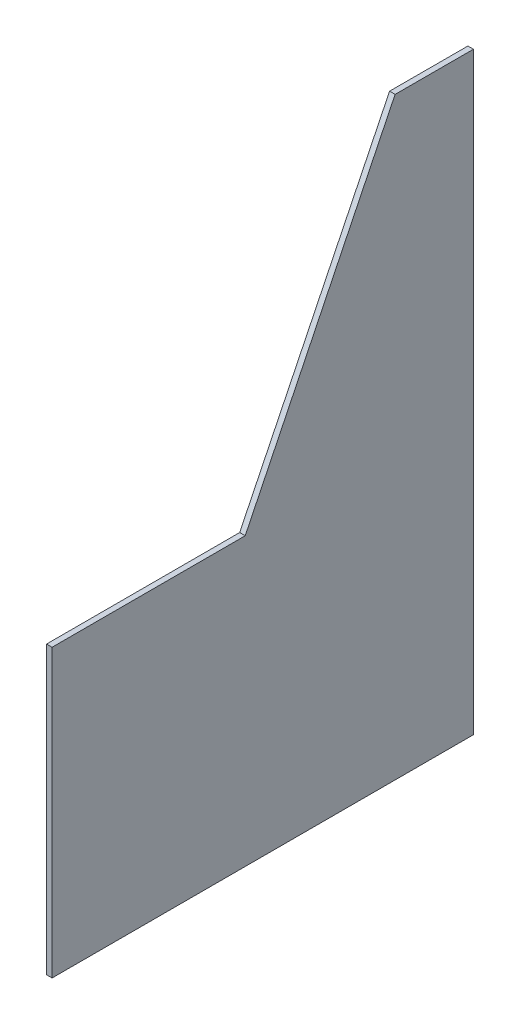
ISO-10303-21;
HEADER;
FILE_DESCRIPTION(('STEP AP214'),'2;1');
FILE_NAME('part.step','',(''),(''),'','','');
FILE_SCHEMA(('AUTOMOTIVE_DESIGN { 1 0 10303 214 1 1 1 1 }'));
ENDSEC;
DATA;
#1=APPLICATION_CONTEXT('core data for automotive mechanical design processes');
#2=APPLICATION_PROTOCOL_DEFINITION('international standard','automotive_design',2000,#1);
#3=PRODUCT_CONTEXT('',#1,'mechanical');
#4=PRODUCT('Part','Part','',(#3));
#5=PRODUCT_RELATED_PRODUCT_CATEGORY('part','',(#4));
#6=PRODUCT_DEFINITION_FORMATION('','',#4);
#7=PRODUCT_DEFINITION_CONTEXT('part definition',#1,'design');
#8=PRODUCT_DEFINITION('design','',#6,#7);
#9=PRODUCT_DEFINITION_SHAPE('','',#8);
#10=(LENGTH_UNIT() NAMED_UNIT(*) SI_UNIT(.MILLI.,.METRE.));
#11=(NAMED_UNIT(*) PLANE_ANGLE_UNIT() SI_UNIT($,.RADIAN.));
#12=(NAMED_UNIT(*) SI_UNIT($,.STERADIAN.) SOLID_ANGLE_UNIT());
#13=UNCERTAINTY_MEASURE_WITH_UNIT(LENGTH_MEASURE(1.E-05),#10,'distance_accuracy_value','');
#14=(GEOMETRIC_REPRESENTATION_CONTEXT(3) GLOBAL_UNCERTAINTY_ASSIGNED_CONTEXT((#13)) GLOBAL_UNIT_ASSIGNED_CONTEXT((#10,
#11,#12)) REPRESENTATION_CONTEXT('',''));
#15=CARTESIAN_POINT('',(0.,0.,0.));
#16=DIRECTION('',(0.,0.,1.));
#17=DIRECTION('',(1.,0.,0.));
#18=AXIS2_PLACEMENT_3D('',#15,#16,#17);
#19=CARTESIAN_POINT('',(6.,0.,-456.));
#20=DIRECTION('',(0.,0.,1.));
#21=DIRECTION('',(0.,-1.,0.));
#22=AXIS2_PLACEMENT_3D('',#19,#20,#21);
#23=PLANE('',#22);
#24=DIRECTION('',(0.,1.,0.));
#25=VECTOR('',#24,1.);
#26=CARTESIAN_POINT('',(0.,0.,-456.));
#27=LINE('',#26,#25);
#28=CARTESIAN_POINT('',(0.,0.,-456.));
#29=VERTEX_POINT('',#28);
#30=CARTESIAN_POINT('',(0.,642.5,-456.000000000002));
#31=VERTEX_POINT('',#30);
#32=EDGE_CURVE('E117',#29,#31,#27,.T.);
#33=ORIENTED_EDGE('',*,*,#32,.T.);
#34=DIRECTION('',(-1.,0.,0.));
#35=VECTOR('',#34,1.);
#36=CARTESIAN_POINT('',(6.,642.5,-456.000000000002));
#37=LINE('',#36,#35);
#38=CARTESIAN_POINT('',(6.,642.5,-456.000000000002));
#39=VERTEX_POINT('',#38);
#40=EDGE_CURVE('E11',#39,#31,#37,.T.);
#41=ORIENTED_EDGE('',*,*,#40,.F.);
#42=DIRECTION('',(0.,1.,0.));
#43=VECTOR('',#42,1.);
#44=CARTESIAN_POINT('',(6.,0.,-456.));
#45=LINE('',#44,#43);
#46=CARTESIAN_POINT('',(6.,0.,-456.));
#47=VERTEX_POINT('',#46);
#48=EDGE_CURVE('E127',#47,#39,#45,.T.);
#49=ORIENTED_EDGE('',*,*,#48,.F.);
#50=DIRECTION('',(-1.,0.,0.));
#51=VECTOR('',#50,1.);
#52=CARTESIAN_POINT('',(6.,0.,-456.));
#53=LINE('',#52,#51);
#54=EDGE_CURVE('E113',#47,#29,#53,.T.);
#55=ORIENTED_EDGE('',*,*,#54,.T.);
#56=EDGE_LOOP('',(#33,#41,#49,#55));
#57=FACE_BOUND('',#56,.T.);
#58=ADVANCED_FACE('F33',(#57),#23,.F.);
#59=CARTESIAN_POINT('',(6.,642.5,-456.000000000002));
#60=DIRECTION('',(0.,-0.999999798748393,0.000634431377777624));
#61=DIRECTION('',(0.,-0.000634431377777624,-0.999999798748393));
#62=AXIS2_PLACEMENT_3D('',#59,#60,#61);
#63=PLANE('',#62);
#64=DIRECTION('',(0.,0.000634431377777624,0.999999798748393));
#65=VECTOR('',#64,1.);
#66=CARTESIAN_POINT('',(0.,642.5,-456.000000000002));
#67=LINE('',#66,#65);
#68=CARTESIAN_POINT('',(0.,642.553801489204,-371.197324311941));
#69=VERTEX_POINT('',#68);
#70=EDGE_CURVE('E120',#31,#69,#67,.T.);
#71=ORIENTED_EDGE('',*,*,#70,.T.);
#72=DIRECTION('',(-1.,0.,0.));
#73=VECTOR('',#72,1.);
#74=CARTESIAN_POINT('',(6.,642.553801489204,-371.197324311941));
#75=LINE('',#74,#73);
#76=CARTESIAN_POINT('',(6.,642.553801489204,-371.197324311941));
#77=VERTEX_POINT('',#76);
#78=EDGE_CURVE('E41',#77,#69,#75,.T.);
#79=ORIENTED_EDGE('',*,*,#78,.F.);
#80=DIRECTION('',(0.,0.000634431377777624,0.999999798748393));
#81=VECTOR('',#80,1.);
#82=CARTESIAN_POINT('',(6.,642.5,-456.000000000002));
#83=LINE('',#82,#81);
#84=EDGE_CURVE('E86',#39,#77,#83,.T.);
#85=ORIENTED_EDGE('',*,*,#84,.F.);
#86=ORIENTED_EDGE('',*,*,#40,.T.);
#87=EDGE_LOOP('',(#71,#79,#85,#86));
#88=FACE_BOUND('',#87,.T.);
#89=ADVANCED_FACE('F151',(#88),#63,.F.);
#90=CARTESIAN_POINT('',(6.,642.553801489204,-371.197324311941));
#91=DIRECTION('',(0.,-0.43837114678903,-0.89879404629919));
#92=DIRECTION('',(0.,0.89879404629919,-0.43837114678903));
#93=AXIS2_PLACEMENT_3D('',#90,#91,#92);
#94=PLANE('',#93);
#95=DIRECTION('',(0.,-0.89879404629919,0.43837114678903));
#96=VECTOR('',#95,1.);
#97=CARTESIAN_POINT('',(0.,642.553801489204,-371.197324311941));
#98=LINE('',#97,#96);
#99=CARTESIAN_POINT('',(0.,310.000004358503,-209.));
#100=VERTEX_POINT('',#99);
#101=EDGE_CURVE('E122',#69,#100,#98,.T.);
#102=ORIENTED_EDGE('',*,*,#101,.T.);
#103=DIRECTION('',(-1.,0.,0.));
#104=VECTOR('',#103,1.);
#105=CARTESIAN_POINT('',(6.,310.000004358503,-209.));
#106=LINE('',#105,#104);
#107=CARTESIAN_POINT('',(6.,310.000004358503,-209.));
#108=VERTEX_POINT('',#107);
#109=EDGE_CURVE('E108',#108,#100,#106,.T.);
#110=ORIENTED_EDGE('',*,*,#109,.F.);
#111=DIRECTION('',(0.,-0.89879404629919,0.43837114678903));
#112=VECTOR('',#111,1.);
#113=CARTESIAN_POINT('',(6.,642.553801489204,-371.197324311941));
#114=LINE('',#113,#112);
#115=EDGE_CURVE('E99',#77,#108,#114,.T.);
#116=ORIENTED_EDGE('',*,*,#115,.F.);
#117=ORIENTED_EDGE('',*,*,#78,.T.);
#118=EDGE_LOOP('',(#102,#110,#116,#117));
#119=FACE_BOUND('',#118,.T.);
#120=ADVANCED_FACE('F133',(#119),#94,.F.);
#121=CARTESIAN_POINT('',(6.,310.000004358503,-209.));
#122=DIRECTION('',(0.,-1.,-2.0854083478679E-08));
#123=DIRECTION('',(0.,2.0854083478679E-08,-1.));
#124=AXIS2_PLACEMENT_3D('',#121,#122,#123);
#125=PLANE('',#124);
#126=DIRECTION('',(0.,-2.0854083478679E-08,1.));
#127=VECTOR('',#126,1.);
#128=CARTESIAN_POINT('',(0.,310.000004358503,-209.));
#129=LINE('',#128,#127);
#130=CARTESIAN_POINT('',(0.,310.,0.));
#131=VERTEX_POINT('',#130);
#132=EDGE_CURVE('E107',#100,#131,#129,.T.);
#133=ORIENTED_EDGE('',*,*,#132,.T.);
#134=DIRECTION('',(-1.,0.,0.));
#135=VECTOR('',#134,1.);
#136=CARTESIAN_POINT('',(6.,310.,0.));
#137=LINE('',#136,#135);
#138=CARTESIAN_POINT('',(6.,310.,0.));
#139=VERTEX_POINT('',#138);
#140=EDGE_CURVE('E104',#139,#131,#137,.T.);
#141=ORIENTED_EDGE('',*,*,#140,.F.);
#142=DIRECTION('',(0.,-2.0854083478679E-08,1.));
#143=VECTOR('',#142,1.);
#144=CARTESIAN_POINT('',(6.,310.000004358503,-209.));
#145=LINE('',#144,#143);
#146=EDGE_CURVE('E93',#108,#139,#145,.T.);
#147=ORIENTED_EDGE('',*,*,#146,.F.);
#148=ORIENTED_EDGE('',*,*,#109,.T.);
#149=EDGE_LOOP('',(#133,#141,#147,#148));
#150=FACE_BOUND('',#149,.T.);
#151=ADVANCED_FACE('F105',(#150),#125,.F.);
#152=CARTESIAN_POINT('',(6.,310.,0.));
#153=DIRECTION('',(0.,0.,-1.));
#154=DIRECTION('',(0.,1.,0.));
#155=AXIS2_PLACEMENT_3D('',#152,#153,#154);
#156=PLANE('',#155);
#157=DIRECTION('',(0.,-1.,0.));
#158=VECTOR('',#157,1.);
#159=CARTESIAN_POINT('',(0.,310.,0.));
#160=LINE('',#159,#158);
#161=CARTESIAN_POINT('',(0.,0.,0.));
#162=VERTEX_POINT('',#161);
#163=EDGE_CURVE('E72',#131,#162,#160,.T.);
#164=ORIENTED_EDGE('',*,*,#163,.T.);
#165=DIRECTION('',(-1.,0.,0.));
#166=VECTOR('',#165,1.);
#167=CARTESIAN_POINT('',(6.,0.,0.));
#168=LINE('',#167,#166);
#169=CARTESIAN_POINT('',(6.,0.,0.));
#170=VERTEX_POINT('',#169);
#171=EDGE_CURVE('E109',#170,#162,#168,.T.);
#172=ORIENTED_EDGE('',*,*,#171,.F.);
#173=DIRECTION('',(0.,-1.,0.));
#174=VECTOR('',#173,1.);
#175=CARTESIAN_POINT('',(6.,310.,0.));
#176=LINE('',#175,#174);
#177=EDGE_CURVE('E97',#139,#170,#176,.T.);
#178=ORIENTED_EDGE('',*,*,#177,.F.);
#179=ORIENTED_EDGE('',*,*,#140,.T.);
#180=EDGE_LOOP('',(#164,#172,#178,#179));
#181=FACE_BOUND('',#180,.T.);
#182=ADVANCED_FACE('F111',(#181),#156,.F.);
#183=CARTESIAN_POINT('',(6.,0.,0.));
#184=DIRECTION('',(0.,1.,0.));
#185=DIRECTION('',(0.,0.,1.));
#186=AXIS2_PLACEMENT_3D('',#183,#184,#185);
#187=PLANE('',#186);
#188=DIRECTION('',(0.,0.,-1.));
#189=VECTOR('',#188,1.);
#190=CARTESIAN_POINT('',(0.,0.,0.));
#191=LINE('',#190,#189);
#192=EDGE_CURVE('E78',#162,#29,#191,.T.);
#193=ORIENTED_EDGE('',*,*,#192,.T.);
#194=ORIENTED_EDGE('',*,*,#54,.F.);
#195=DIRECTION('',(0.,0.,-1.));
#196=VECTOR('',#195,1.);
#197=CARTESIAN_POINT('',(6.,0.,0.));
#198=LINE('',#197,#196);
#199=EDGE_CURVE('E49',#170,#47,#198,.T.);
#200=ORIENTED_EDGE('',*,*,#199,.F.);
#201=ORIENTED_EDGE('',*,*,#171,.T.);
#202=EDGE_LOOP('',(#193,#194,#200,#201));
#203=FACE_BOUND('',#202,.T.);
#204=ADVANCED_FACE('F140',(#203),#187,.F.);
#205=CARTESIAN_POINT('',(6.,0.,0.));
#206=DIRECTION('',(-1.,0.,0.));
#207=DIRECTION('',(0.,0.,1.));
#208=AXIS2_PLACEMENT_3D('',#205,#206,#207);
#209=PLANE('',#208);
#210=ORIENTED_EDGE('',*,*,#48,.T.);
#211=ORIENTED_EDGE('',*,*,#84,.T.);
#212=ORIENTED_EDGE('',*,*,#115,.T.);
#213=ORIENTED_EDGE('',*,*,#146,.T.);
#214=ORIENTED_EDGE('',*,*,#177,.T.);
#215=ORIENTED_EDGE('',*,*,#199,.T.);
#216=EDGE_LOOP('',(#210,#211,#212,#213,#214,#215));
#217=FACE_BOUND('',#216,.T.);
#218=ADVANCED_FACE('F95',(#217),#209,.F.);
#219=CARTESIAN_POINT('',(0.,0.,0.));
#220=DIRECTION('',(-1.,0.,0.));
#221=DIRECTION('',(0.,0.,1.));
#222=AXIS2_PLACEMENT_3D('',#219,#220,#221);
#223=PLANE('',#222);
#224=ORIENTED_EDGE('',*,*,#32,.F.);
#225=ORIENTED_EDGE('',*,*,#192,.F.);
#226=ORIENTED_EDGE('',*,*,#163,.F.);
#227=ORIENTED_EDGE('',*,*,#132,.F.);
#228=ORIENTED_EDGE('',*,*,#101,.F.);
#229=ORIENTED_EDGE('',*,*,#70,.F.);
#230=EDGE_LOOP('',(#224,#225,#226,#227,#228,#229));
#231=FACE_BOUND('',#230,.T.);
#232=ADVANCED_FACE('F136',(#231),#223,.T.);
#233=CLOSED_SHELL('',(#58,#89,#120,#151,#182,#204,#218,#232));
#234=MANIFOLD_SOLID_BREP('B2',#233);
#235=ADVANCED_BREP_SHAPE_REPRESENTATION('',(#18,#234),#14);
#236=SHAPE_DEFINITION_REPRESENTATION(#9,#235);
ENDSEC;
END-ISO-10303-21;
